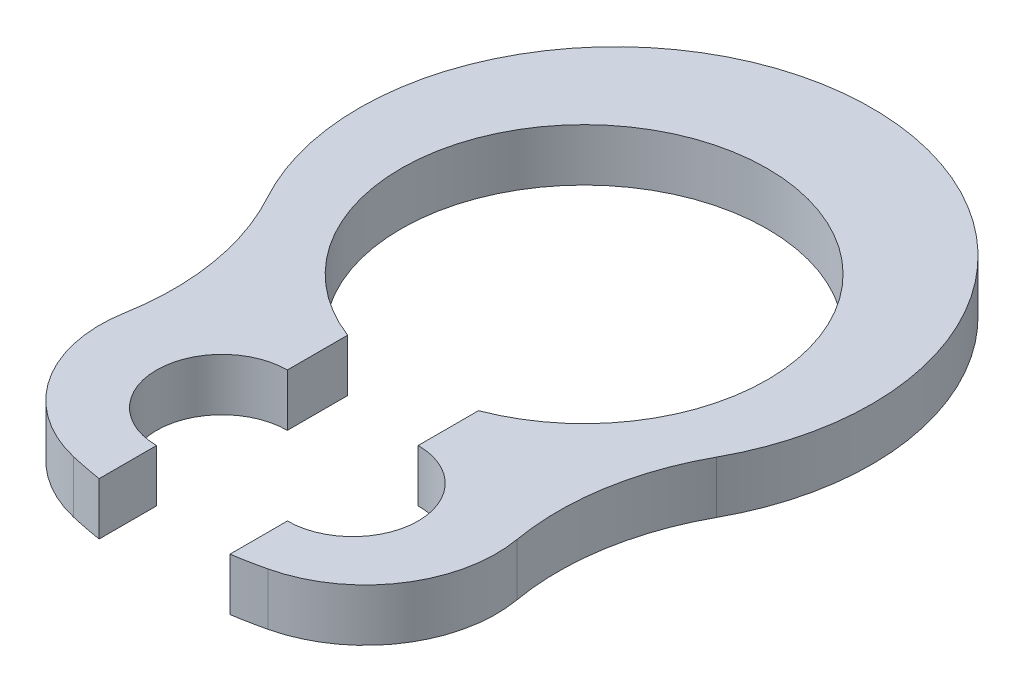
ISO-10303-21;
HEADER;
FILE_DESCRIPTION(('STEP AP214'),'2;1');
FILE_NAME('part.step','',(''),(''),'','','');
FILE_SCHEMA(('AUTOMOTIVE_DESIGN { 1 0 10303 214 1 1 1 1 }'));
ENDSEC;
DATA;
#1=APPLICATION_CONTEXT('core data for automotive mechanical design processes');
#2=APPLICATION_PROTOCOL_DEFINITION('international standard','automotive_design',2000,#1);
#3=PRODUCT_CONTEXT('',#1,'mechanical');
#4=PRODUCT('Part','Part','',(#3));
#5=PRODUCT_RELATED_PRODUCT_CATEGORY('part','',(#4));
#6=PRODUCT_DEFINITION_FORMATION('','',#4);
#7=PRODUCT_DEFINITION_CONTEXT('part definition',#1,'design');
#8=PRODUCT_DEFINITION('design','',#6,#7);
#9=PRODUCT_DEFINITION_SHAPE('','',#8);
#10=(LENGTH_UNIT() NAMED_UNIT(*) SI_UNIT(.MILLI.,.METRE.));
#11=(NAMED_UNIT(*) PLANE_ANGLE_UNIT() SI_UNIT($,.RADIAN.));
#12=(NAMED_UNIT(*) SI_UNIT($,.STERADIAN.) SOLID_ANGLE_UNIT());
#13=UNCERTAINTY_MEASURE_WITH_UNIT(LENGTH_MEASURE(1.E-05),#10,'distance_accuracy_value','');
#14=(GEOMETRIC_REPRESENTATION_CONTEXT(3) GLOBAL_UNCERTAINTY_ASSIGNED_CONTEXT((#13)) GLOBAL_UNIT_ASSIGNED_CONTEXT((#10,
#11,#12)) REPRESENTATION_CONTEXT('',''));
#15=CARTESIAN_POINT('',(0.,0.,0.));
#16=DIRECTION('',(0.,0.,1.));
#17=DIRECTION('',(1.,0.,0.));
#18=AXIS2_PLACEMENT_3D('',#15,#16,#17);
#19=CARTESIAN_POINT('',(0.5,0.4,1.3076696830622));
#20=DIRECTION('',(1.,0.,0.));
#21=DIRECTION('',(0.,0.,-1.));
#22=AXIS2_PLACEMENT_3D('',#19,#20,#21);
#23=PLANE('',#22);
#24=DIRECTION('',(0.,0.,1.));
#25=VECTOR('',#24,1.);
#26=CARTESIAN_POINT('',(0.5,0.,1.3076696830622));
#27=LINE('',#26,#25);
#28=CARTESIAN_POINT('',(0.500000000000001,0.,1.3076696830622));
#29=VERTEX_POINT('',#28);
#30=CARTESIAN_POINT('',(0.5,0.,1.76875949169618));
#31=VERTEX_POINT('',#30);
#32=EDGE_CURVE('E191',#29,#31,#27,.T.);
#33=ORIENTED_EDGE('',*,*,#32,.T.);
#34=DIRECTION('',(0.,1.,0.));
#35=VECTOR('',#34,1.);
#36=CARTESIAN_POINT('',(0.5,0.,1.76875949169618));
#37=LINE('',#36,#35);
#38=CARTESIAN_POINT('',(0.5,0.4,1.76875949169618));
#39=VERTEX_POINT('',#38);
#40=EDGE_CURVE('E58',#31,#39,#37,.T.);
#41=ORIENTED_EDGE('',*,*,#40,.T.);
#42=DIRECTION('',(0.,0.,1.));
#43=VECTOR('',#42,1.);
#44=CARTESIAN_POINT('',(0.5,0.4,1.3076696830622));
#45=LINE('',#44,#43);
#46=CARTESIAN_POINT('',(0.500000000000001,0.4,1.3076696830622));
#47=VERTEX_POINT('',#46);
#48=EDGE_CURVE('E156',#47,#39,#45,.T.);
#49=ORIENTED_EDGE('',*,*,#48,.F.);
#50=DIRECTION('',(0.,-1.,0.));
#51=VECTOR('',#50,1.);
#52=CARTESIAN_POINT('',(0.500000000000001,0.4,1.3076696830622));
#53=LINE('',#52,#51);
#54=EDGE_CURVE('E225',#47,#29,#53,.T.);
#55=ORIENTED_EDGE('',*,*,#54,.T.);
#56=EDGE_LOOP('',(#33,#41,#49,#55));
#57=FACE_BOUND('',#56,.T.);
#58=ADVANCED_FACE('F43',(#57),#23,.F.);
#59=CARTESIAN_POINT('',(-0.5,0.4,3.2076696830622));
#60=DIRECTION('',(-1.,0.,0.));
#61=DIRECTION('',(0.,0.,1.));
#62=AXIS2_PLACEMENT_3D('',#59,#60,#61);
#63=PLANE('',#62);
#64=DIRECTION('',(0.,0.,-1.));
#65=VECTOR('',#64,1.);
#66=CARTESIAN_POINT('',(-0.5,0.,3.2076696830622));
#67=LINE('',#66,#65);
#68=CARTESIAN_POINT('',(-0.5,0.,3.2076696830622));
#69=VERTEX_POINT('',#68);
#70=CARTESIAN_POINT('',(-0.5,0.,2.76875949169618));
#71=VERTEX_POINT('',#70);
#72=EDGE_CURVE('E185',#69,#71,#67,.T.);
#73=ORIENTED_EDGE('',*,*,#72,.T.);
#74=DIRECTION('',(0.,1.,0.));
#75=VECTOR('',#74,1.);
#76=CARTESIAN_POINT('',(-0.5,0.,2.76875949169618));
#77=LINE('',#76,#75);
#78=CARTESIAN_POINT('',(-0.5,0.4,2.76875949169618));
#79=VERTEX_POINT('',#78);
#80=EDGE_CURVE('E65',#71,#79,#77,.T.);
#81=ORIENTED_EDGE('',*,*,#80,.T.);
#82=DIRECTION('',(0.,0.,-1.));
#83=VECTOR('',#82,1.);
#84=CARTESIAN_POINT('',(-0.5,0.4,3.2076696830622));
#85=LINE('',#84,#83);
#86=CARTESIAN_POINT('',(-0.5,0.4,3.2076696830622));
#87=VERTEX_POINT('',#86);
#88=EDGE_CURVE('E165',#87,#79,#85,.T.);
#89=ORIENTED_EDGE('',*,*,#88,.F.);
#90=DIRECTION('',(0.,-1.,0.));
#91=VECTOR('',#90,1.);
#92=CARTESIAN_POINT('',(-0.5,0.4,3.2076696830622));
#93=LINE('',#92,#91);
#94=EDGE_CURVE('E51',#87,#69,#93,.T.);
#95=ORIENTED_EDGE('',*,*,#94,.T.);
#96=EDGE_LOOP('',(#73,#81,#89,#95));
#97=FACE_BOUND('',#96,.T.);
#98=ADVANCED_FACE('F233',(#97),#63,.F.);
#99=CARTESIAN_POINT('',(0.,0.4,0.));
#100=DIRECTION('',(0.,-1.,0.));
#101=DIRECTION('',(0.,0.,-1.));
#102=AXIS2_PLACEMENT_3D('',#99,#100,#101);
#103=CYLINDRICAL_SURFACE('',#102,3.24640490321777);
#104=CARTESIAN_POINT('',(0.,0.,0.));
#105=DIRECTION('',(0.,1.,0.));
#106=DIRECTION('',(0.,0.,-1.));
#107=AXIS2_PLACEMENT_3D('',#104,#105,#106);
#108=CIRCLE('',#107,3.24640490321777);
#109=CARTESIAN_POINT('',(-0.744313737359562,0.,3.15992750803151));
#110=VERTEX_POINT('',#109);
#111=EDGE_CURVE('E181',#110,#69,#108,.T.);
#112=ORIENTED_EDGE('',*,*,#111,.T.);
#113=ORIENTED_EDGE('',*,*,#94,.F.);
#114=CARTESIAN_POINT('',(0.,0.4,0.));
#115=DIRECTION('',(0.,1.,0.));
#116=DIRECTION('',(0.,0.,-1.));
#117=AXIS2_PLACEMENT_3D('',#114,#115,#116);
#118=CIRCLE('',#117,3.24640490321777);
#119=CARTESIAN_POINT('',(-0.744313737359562,0.4,3.15992750803151));
#120=VERTEX_POINT('',#119);
#121=EDGE_CURVE('E206',#120,#87,#118,.T.);
#122=ORIENTED_EDGE('',*,*,#121,.F.);
#123=DIRECTION('',(0.,-1.,0.));
#124=VECTOR('',#123,1.);
#125=CARTESIAN_POINT('',(-0.744313737359562,0.4,3.15992750803151));
#126=LINE('',#125,#124);
#127=EDGE_CURVE('E180',#120,#110,#126,.T.);
#128=ORIENTED_EDGE('',*,*,#127,.T.);
#129=EDGE_LOOP('',(#112,#113,#122,#128));
#130=FACE_BOUND('',#129,.T.);
#131=ADVANCED_FACE('F45',(#130),#103,.T.);
#132=CARTESIAN_POINT('',(-0.5,0.4,1.76875949169618));
#133=VERTEX_POINT('',#132);
#134=CARTESIAN_POINT('',(-0.5,0.4,1.3076696830622));
#135=VERTEX_POINT('',#134);
#136=EDGE_CURVE('E254',#133,#135,#85,.T.);
#137=ORIENTED_EDGE('',*,*,#136,.F.);
#138=DIRECTION('',(0.,1.,0.));
#139=VECTOR('',#138,1.);
#140=CARTESIAN_POINT('',(-0.5,0.,1.76875949169618));
#141=LINE('',#140,#139);
#142=CARTESIAN_POINT('',(-0.5,0.,1.76875949169618));
#143=VERTEX_POINT('',#142);
#144=EDGE_CURVE('E248',#133,#143,#141,.F.);
#145=ORIENTED_EDGE('',*,*,#144,.T.);
#146=CARTESIAN_POINT('',(-0.5,0.,1.3076696830622));
#147=VERTEX_POINT('',#146);
#148=EDGE_CURVE('E184',#143,#147,#67,.T.);
#149=ORIENTED_EDGE('',*,*,#148,.T.);
#150=DIRECTION('',(0.,-1.,0.));
#151=VECTOR('',#150,1.);
#152=CARTESIAN_POINT('',(-0.5,0.4,1.3076696830622));
#153=LINE('',#152,#151);
#154=EDGE_CURVE('E228',#135,#147,#153,.T.);
#155=ORIENTED_EDGE('',*,*,#154,.F.);
#156=EDGE_LOOP('',(#137,#145,#149,#155));
#157=FACE_BOUND('',#156,.T.);
#158=ADVANCED_FACE('F252',(#157),#63,.F.);
#159=CARTESIAN_POINT('',(0.,0.4,0.));
#160=DIRECTION('',(0.,-1.,0.));
#161=DIRECTION('',(0.,0.,-1.));
#162=AXIS2_PLACEMENT_3D('',#159,#160,#161);
#163=CYLINDRICAL_SURFACE('',#162,1.4);
#164=CARTESIAN_POINT('',(0.,0.,0.));
#165=DIRECTION('',(0.,-1.,0.));
#166=DIRECTION('',(0.,0.,-1.));
#167=AXIS2_PLACEMENT_3D('',#164,#165,#166);
#168=CIRCLE('',#167,1.4);
#169=EDGE_CURVE('E188',#147,#29,#168,.T.);
#170=ORIENTED_EDGE('',*,*,#169,.T.);
#171=ORIENTED_EDGE('',*,*,#54,.F.);
#172=CARTESIAN_POINT('',(0.,0.4,0.));
#173=DIRECTION('',(0.,-1.,0.));
#174=DIRECTION('',(0.,0.,-1.));
#175=AXIS2_PLACEMENT_3D('',#172,#173,#174);
#176=CIRCLE('',#175,1.4);
#177=EDGE_CURVE('E162',#135,#47,#176,.T.);
#178=ORIENTED_EDGE('',*,*,#177,.F.);
#179=ORIENTED_EDGE('',*,*,#154,.T.);
#180=EDGE_LOOP('',(#170,#171,#178,#179));
#181=FACE_BOUND('',#180,.T.);
#182=ADVANCED_FACE('F264',(#181),#163,.F.);
#183=CARTESIAN_POINT('',(0.5,0.4,2.76875949169618));
#184=VERTEX_POINT('',#183);
#185=CARTESIAN_POINT('',(0.5,0.4,3.2076696830622));
#186=VERTEX_POINT('',#185);
#187=EDGE_CURVE('E153',#184,#186,#45,.T.);
#188=ORIENTED_EDGE('',*,*,#187,.F.);
#189=DIRECTION('',(0.,1.,0.));
#190=VECTOR('',#189,1.);
#191=CARTESIAN_POINT('',(0.5,0.,2.76875949169618));
#192=LINE('',#191,#190);
#193=CARTESIAN_POINT('',(0.5,0.,2.76875949169618));
#194=VERTEX_POINT('',#193);
#195=EDGE_CURVE('E141',#184,#194,#192,.F.);
#196=ORIENTED_EDGE('',*,*,#195,.T.);
#197=CARTESIAN_POINT('',(0.5,0.,3.2076696830622));
#198=VERTEX_POINT('',#197);
#199=EDGE_CURVE('E190',#194,#198,#27,.T.);
#200=ORIENTED_EDGE('',*,*,#199,.T.);
#201=DIRECTION('',(0.,-1.,0.));
#202=VECTOR('',#201,1.);
#203=CARTESIAN_POINT('',(0.5,0.4,3.2076696830622));
#204=LINE('',#203,#202);
#205=EDGE_CURVE('E160',#186,#198,#204,.T.);
#206=ORIENTED_EDGE('',*,*,#205,.F.);
#207=EDGE_LOOP('',(#188,#196,#200,#206));
#208=FACE_BOUND('',#207,.T.);
#209=ADVANCED_FACE('F158',(#208),#23,.F.);
#210=CARTESIAN_POINT('',(0.,0.4,0.));
#211=DIRECTION('',(0.,-1.,0.));
#212=DIRECTION('',(0.,0.,-1.));
#213=AXIS2_PLACEMENT_3D('',#210,#211,#212);
#214=CYLINDRICAL_SURFACE('',#213,3.24640490321777);
#215=CARTESIAN_POINT('',(0.,0.,0.));
#216=DIRECTION('',(0.,1.,0.));
#217=DIRECTION('',(0.,0.,1.));
#218=AXIS2_PLACEMENT_3D('',#215,#216,#217);
#219=CIRCLE('',#218,3.24640490321777);
#220=CARTESIAN_POINT('',(0.744313737359561,0.,3.15992750803151));
#221=VERTEX_POINT('',#220);
#222=EDGE_CURVE('E194',#198,#221,#219,.T.);
#223=ORIENTED_EDGE('',*,*,#222,.T.);
#224=DIRECTION('',(0.,-1.,0.));
#225=VECTOR('',#224,1.);
#226=CARTESIAN_POINT('',(0.744313737359561,0.4,3.15992750803151));
#227=LINE('',#226,#225);
#228=CARTESIAN_POINT('',(0.744313737359561,0.4,3.15992750803151));
#229=VERTEX_POINT('',#228);
#230=EDGE_CURVE('E221',#229,#221,#227,.T.);
#231=ORIENTED_EDGE('',*,*,#230,.F.);
#232=CARTESIAN_POINT('',(0.,0.4,0.));
#233=DIRECTION('',(0.,1.,0.));
#234=DIRECTION('',(0.,0.,1.));
#235=AXIS2_PLACEMENT_3D('',#232,#233,#234);
#236=CIRCLE('',#235,3.24640490321777);
#237=EDGE_CURVE('E164',#186,#229,#236,.T.);
#238=ORIENTED_EDGE('',*,*,#237,.F.);
#239=ORIENTED_EDGE('',*,*,#205,.T.);
#240=EDGE_LOOP('',(#223,#231,#238,#239));
#241=FACE_BOUND('',#240,.T.);
#242=ADVANCED_FACE('F271',(#241),#214,.T.);
#243=CARTESIAN_POINT('',(0.515040507571801,0.4,2.18656540372361));
#244=DIRECTION('',(0.,-1.,0.));
#245=DIRECTION('',(0.,0.,-1.));
#246=AXIS2_PLACEMENT_3D('',#243,#244,#245);
#247=CYLINDRICAL_SURFACE('',#246,0.999999999999999);
#248=CARTESIAN_POINT('',(0.515040507571801,0.,2.18656540372361));
#249=DIRECTION('',(0.,1.,0.));
#250=DIRECTION('',(0.,0.,1.));
#251=AXIS2_PLACEMENT_3D('',#248,#249,#250);
#252=CIRCLE('',#251,0.999999999999999);
#253=CARTESIAN_POINT('',(1.5,0.,2.01377999266242));
#254=VERTEX_POINT('',#253);
#255=EDGE_CURVE('E196',#221,#254,#252,.T.);
#256=ORIENTED_EDGE('',*,*,#255,.T.);
#257=DIRECTION('',(0.,-1.,0.));
#258=VECTOR('',#257,1.);
#259=CARTESIAN_POINT('',(1.5,0.4,2.01377999266242));
#260=LINE('',#259,#258);
#261=CARTESIAN_POINT('',(1.5,0.4,2.01377999266242));
#262=VERTEX_POINT('',#261);
#263=EDGE_CURVE('E218',#262,#254,#260,.T.);
#264=ORIENTED_EDGE('',*,*,#263,.F.);
#265=CARTESIAN_POINT('',(0.515040507571801,0.4,2.18656540372361));
#266=DIRECTION('',(0.,1.,0.));
#267=DIRECTION('',(0.,0.,1.));
#268=AXIS2_PLACEMENT_3D('',#265,#266,#267);
#269=CIRCLE('',#268,0.999999999999999);
#270=EDGE_CURVE('E170',#229,#262,#269,.T.);
#271=ORIENTED_EDGE('',*,*,#270,.F.);
#272=ORIENTED_EDGE('',*,*,#230,.T.);
#273=EDGE_LOOP('',(#256,#264,#271,#272));
#274=FACE_BOUND('',#273,.T.);
#275=ADVANCED_FACE('F278',(#274),#247,.T.);
#276=CARTESIAN_POINT('',(3.4699189848564,0.4,1.66820917054005));
#277=DIRECTION('',(0.,-1.,0.));
#278=DIRECTION('',(0.,0.,-1.));
#279=AXIS2_PLACEMENT_3D('',#276,#277,#278);
#280=CYLINDRICAL_SURFACE('',#279,2.);
#281=CARTESIAN_POINT('',(3.4699189848564,0.,1.66820917054005));
#282=DIRECTION('',(0.,-1.,0.));
#283=DIRECTION('',(0.,0.,-1.));
#284=AXIS2_PLACEMENT_3D('',#281,#282,#283);
#285=CIRCLE('',#284,2.);
#286=CARTESIAN_POINT('',(1.71743464907034,0.,0.704467165216792));
#287=VERTEX_POINT('',#286);
#288=EDGE_CURVE('E198',#254,#287,#285,.T.);
#289=ORIENTED_EDGE('',*,*,#288,.T.);
#290=DIRECTION('',(0.,-1.,0.));
#291=VECTOR('',#290,1.);
#292=CARTESIAN_POINT('',(1.71743464907034,0.4,0.704467165216792));
#293=LINE('',#292,#291);
#294=CARTESIAN_POINT('',(1.71743464907034,0.4,0.704467165216792));
#295=VERTEX_POINT('',#294);
#296=EDGE_CURVE('E215',#295,#287,#293,.T.);
#297=ORIENTED_EDGE('',*,*,#296,.F.);
#298=CARTESIAN_POINT('',(3.4699189848564,0.4,1.66820917054005));
#299=DIRECTION('',(0.,-1.,0.));
#300=DIRECTION('',(0.,0.,-1.));
#301=AXIS2_PLACEMENT_3D('',#298,#299,#300);
#302=CIRCLE('',#301,2.);
#303=EDGE_CURVE('E172',#262,#295,#302,.T.);
#304=ORIENTED_EDGE('',*,*,#303,.F.);
#305=ORIENTED_EDGE('',*,*,#263,.T.);
#306=EDGE_LOOP('',(#289,#297,#304,#305));
#307=FACE_BOUND('',#306,.T.);
#308=ADVANCED_FACE('F281',(#307),#280,.F.);
#309=CARTESIAN_POINT('',(0.,0.4,-0.24));
#310=DIRECTION('',(0.,-1.,0.));
#311=DIRECTION('',(0.,0.,-1.));
#312=AXIS2_PLACEMENT_3D('',#309,#310,#311);
#313=CYLINDRICAL_SURFACE('',#312,1.96);
#314=CARTESIAN_POINT('',(0.,0.,-0.24));
#315=DIRECTION('',(0.,1.,0.));
#316=DIRECTION('',(0.,0.,-1.));
#317=AXIS2_PLACEMENT_3D('',#314,#315,#316);
#318=CIRCLE('',#317,1.96);
#319=CARTESIAN_POINT('',(-1.71743464907034,0.,0.704467165216794));
#320=VERTEX_POINT('',#319);
#321=EDGE_CURVE('E200',#287,#320,#318,.T.);
#322=ORIENTED_EDGE('',*,*,#321,.T.);
#323=DIRECTION('',(0.,-1.,0.));
#324=VECTOR('',#323,1.);
#325=CARTESIAN_POINT('',(-1.71743464907034,0.4,0.704467165216794));
#326=LINE('',#325,#324);
#327=CARTESIAN_POINT('',(-1.71743464907034,0.4,0.704467165216794));
#328=VERTEX_POINT('',#327);
#329=EDGE_CURVE('E212',#328,#320,#326,.T.);
#330=ORIENTED_EDGE('',*,*,#329,.F.);
#331=CARTESIAN_POINT('',(0.,0.4,-0.24));
#332=DIRECTION('',(0.,1.,0.));
#333=DIRECTION('',(0.,0.,-1.));
#334=AXIS2_PLACEMENT_3D('',#331,#332,#333);
#335=CIRCLE('',#334,1.96);
#336=EDGE_CURVE('E174',#295,#328,#335,.T.);
#337=ORIENTED_EDGE('',*,*,#336,.F.);
#338=ORIENTED_EDGE('',*,*,#296,.T.);
#339=EDGE_LOOP('',(#322,#330,#337,#338));
#340=FACE_BOUND('',#339,.T.);
#341=ADVANCED_FACE('F286',(#340),#313,.T.);
#342=CARTESIAN_POINT('',(-3.4699189848564,0.4,1.66820917054005));
#343=DIRECTION('',(0.,-1.,0.));
#344=DIRECTION('',(0.,0.,-1.));
#345=AXIS2_PLACEMENT_3D('',#342,#343,#344);
#346=CYLINDRICAL_SURFACE('',#345,2.);
#347=CARTESIAN_POINT('',(-3.4699189848564,0.,1.66820917054005));
#348=DIRECTION('',(0.,-1.,0.));
#349=DIRECTION('',(0.,0.,-1.));
#350=AXIS2_PLACEMENT_3D('',#347,#348,#349);
#351=CIRCLE('',#350,2.);
#352=CARTESIAN_POINT('',(-1.5,0.,2.01377999266242));
#353=VERTEX_POINT('',#352);
#354=EDGE_CURVE('E202',#320,#353,#351,.T.);
#355=ORIENTED_EDGE('',*,*,#354,.T.);
#356=DIRECTION('',(0.,-1.,0.));
#357=VECTOR('',#356,1.);
#358=CARTESIAN_POINT('',(-1.5,0.4,2.01377999266242));
#359=LINE('',#358,#357);
#360=CARTESIAN_POINT('',(-1.5,0.4,2.01377999266242));
#361=VERTEX_POINT('',#360);
#362=EDGE_CURVE('E209',#361,#353,#359,.T.);
#363=ORIENTED_EDGE('',*,*,#362,.F.);
#364=CARTESIAN_POINT('',(-3.4699189848564,0.4,1.66820917054005));
#365=DIRECTION('',(0.,-1.,0.));
#366=DIRECTION('',(0.,0.,-1.));
#367=AXIS2_PLACEMENT_3D('',#364,#365,#366);
#368=CIRCLE('',#367,2.);
#369=EDGE_CURVE('E176',#328,#361,#368,.T.);
#370=ORIENTED_EDGE('',*,*,#369,.F.);
#371=ORIENTED_EDGE('',*,*,#329,.T.);
#372=EDGE_LOOP('',(#355,#363,#370,#371));
#373=FACE_BOUND('',#372,.T.);
#374=ADVANCED_FACE('F291',(#373),#346,.F.);
#375=CARTESIAN_POINT('',(-0.515040507571801,0.4,2.18656540372361));
#376=DIRECTION('',(0.,-1.,0.));
#377=DIRECTION('',(0.,0.,-1.));
#378=AXIS2_PLACEMENT_3D('',#375,#376,#377);
#379=CYLINDRICAL_SURFACE('',#378,1.);
#380=CARTESIAN_POINT('',(-0.515040507571801,0.,2.18656540372361));
#381=DIRECTION('',(0.,1.,0.));
#382=DIRECTION('',(0.,0.,1.));
#383=AXIS2_PLACEMENT_3D('',#380,#381,#382);
#384=CIRCLE('',#383,1.);
#385=EDGE_CURVE('E204',#353,#110,#384,.T.);
#386=ORIENTED_EDGE('',*,*,#385,.T.);
#387=ORIENTED_EDGE('',*,*,#127,.F.);
#388=CARTESIAN_POINT('',(-0.515040507571801,0.4,2.18656540372361));
#389=DIRECTION('',(0.,1.,0.));
#390=DIRECTION('',(0.,0.,1.));
#391=AXIS2_PLACEMENT_3D('',#388,#389,#390);
#392=CIRCLE('',#391,1.);
#393=EDGE_CURVE('E178',#361,#120,#392,.T.);
#394=ORIENTED_EDGE('',*,*,#393,.F.);
#395=ORIENTED_EDGE('',*,*,#362,.T.);
#396=EDGE_LOOP('',(#386,#387,#394,#395));
#397=FACE_BOUND('',#396,.T.);
#398=ADVANCED_FACE('F293',(#397),#379,.T.);
#399=CARTESIAN_POINT('',(0.,0.4,0.));
#400=DIRECTION('',(0.,-1.,0.));
#401=DIRECTION('',(0.,0.,-1.));
#402=AXIS2_PLACEMENT_3D('',#399,#400,#401);
#403=PLANE('',#402);
#404=ORIENTED_EDGE('',*,*,#48,.T.);
#405=CARTESIAN_POINT('',(0.5,0.4,2.26875949169618));
#406=DIRECTION('',(0.,1.,0.));
#407=DIRECTION('',(0.,0.,1.));
#408=AXIS2_PLACEMENT_3D('',#405,#406,#407);
#409=CIRCLE('',#408,0.5);
#410=EDGE_CURVE('E144',#184,#39,#409,.T.);
#411=ORIENTED_EDGE('',*,*,#410,.F.);
#412=ORIENTED_EDGE('',*,*,#187,.T.);
#413=ORIENTED_EDGE('',*,*,#237,.T.);
#414=ORIENTED_EDGE('',*,*,#270,.T.);
#415=ORIENTED_EDGE('',*,*,#303,.T.);
#416=ORIENTED_EDGE('',*,*,#336,.T.);
#417=ORIENTED_EDGE('',*,*,#369,.T.);
#418=ORIENTED_EDGE('',*,*,#393,.T.);
#419=ORIENTED_EDGE('',*,*,#121,.T.);
#420=ORIENTED_EDGE('',*,*,#88,.T.);
#421=CARTESIAN_POINT('',(-0.5,0.4,2.26875949169618));
#422=DIRECTION('',(0.,1.,0.));
#423=DIRECTION('',(0.,0.,1.));
#424=AXIS2_PLACEMENT_3D('',#421,#422,#423);
#425=CIRCLE('',#424,0.5);
#426=EDGE_CURVE('E255',#133,#79,#425,.T.);
#427=ORIENTED_EDGE('',*,*,#426,.F.);
#428=ORIENTED_EDGE('',*,*,#136,.T.);
#429=ORIENTED_EDGE('',*,*,#177,.T.);
#430=EDGE_LOOP('',(#404,#411,#412,#413,#414,#415,#416,#417,#418,#419,#420,#427,#428,#429));
#431=FACE_BOUND('',#430,.T.);
#432=ADVANCED_FACE('F152',(#431),#403,.F.);
#433=CARTESIAN_POINT('',(0.,0.,0.));
#434=DIRECTION('',(0.,-1.,0.));
#435=DIRECTION('',(0.,0.,-1.));
#436=AXIS2_PLACEMENT_3D('',#433,#434,#435);
#437=PLANE('',#436);
#438=CARTESIAN_POINT('',(0.5,0.,2.26875949169618));
#439=DIRECTION('',(0.,1.,0.));
#440=DIRECTION('',(0.,0.,1.));
#441=AXIS2_PLACEMENT_3D('',#438,#439,#440);
#442=CIRCLE('',#441,0.5);
#443=EDGE_CURVE('E145',#194,#31,#442,.T.);
#444=ORIENTED_EDGE('',*,*,#443,.T.);
#445=ORIENTED_EDGE('',*,*,#32,.F.);
#446=ORIENTED_EDGE('',*,*,#169,.F.);
#447=ORIENTED_EDGE('',*,*,#148,.F.);
#448=CARTESIAN_POINT('',(-0.5,0.,2.26875949169618));
#449=DIRECTION('',(0.,-1.,0.));
#450=DIRECTION('',(0.,0.,-1.));
#451=AXIS2_PLACEMENT_3D('',#448,#449,#450);
#452=CIRCLE('',#451,0.5);
#453=EDGE_CURVE('E12',#71,#143,#452,.T.);
#454=ORIENTED_EDGE('',*,*,#453,.F.);
#455=ORIENTED_EDGE('',*,*,#72,.F.);
#456=ORIENTED_EDGE('',*,*,#111,.F.);
#457=ORIENTED_EDGE('',*,*,#385,.F.);
#458=ORIENTED_EDGE('',*,*,#354,.F.);
#459=ORIENTED_EDGE('',*,*,#321,.F.);
#460=ORIENTED_EDGE('',*,*,#288,.F.);
#461=ORIENTED_EDGE('',*,*,#255,.F.);
#462=ORIENTED_EDGE('',*,*,#222,.F.);
#463=ORIENTED_EDGE('',*,*,#199,.F.);
#464=EDGE_LOOP('',(#444,#445,#446,#447,#454,#455,#456,#457,#458,#459,#460,#461,#462,#463));
#465=FACE_BOUND('',#464,.T.);
#466=ADVANCED_FACE('F242',(#465),#437,.T.);
#467=CARTESIAN_POINT('',(-0.5,0.,2.26875949169618));
#468=DIRECTION('',(0.,1.,0.));
#469=DIRECTION('',(0.,0.,1.));
#470=AXIS2_PLACEMENT_3D('',#467,#468,#469);
#471=CYLINDRICAL_SURFACE('',#470,0.5);
#472=ORIENTED_EDGE('',*,*,#453,.T.);
#473=ORIENTED_EDGE('',*,*,#144,.F.);
#474=ORIENTED_EDGE('',*,*,#426,.T.);
#475=ORIENTED_EDGE('',*,*,#80,.F.);
#476=EDGE_LOOP('',(#472,#473,#474,#475));
#477=FACE_BOUND('',#476,.T.);
#478=ADVANCED_FACE('F247',(#477),#471,.F.);
#479=CARTESIAN_POINT('',(0.5,0.,2.26875949169618));
#480=DIRECTION('',(0.,1.,0.));
#481=DIRECTION('',(0.,0.,1.));
#482=AXIS2_PLACEMENT_3D('',#479,#480,#481);
#483=CYLINDRICAL_SURFACE('',#482,0.5);
#484=ORIENTED_EDGE('',*,*,#443,.F.);
#485=ORIENTED_EDGE('',*,*,#195,.F.);
#486=ORIENTED_EDGE('',*,*,#410,.T.);
#487=ORIENTED_EDGE('',*,*,#40,.F.);
#488=EDGE_LOOP('',(#484,#485,#486,#487));
#489=FACE_BOUND('',#488,.T.);
#490=ADVANCED_FACE('F143',(#489),#483,.F.);
#491=CLOSED_SHELL('',(#58,#98,#131,#158,#182,#209,#242,#275,#308,#341,#374,#398,#432,#466,#478,#490));
#492=MANIFOLD_SOLID_BREP('B2',#491);
#493=ADVANCED_BREP_SHAPE_REPRESENTATION('',(#18,#492),#14);
#494=SHAPE_DEFINITION_REPRESENTATION(#9,#493);
ENDSEC;
END-ISO-10303-21;
